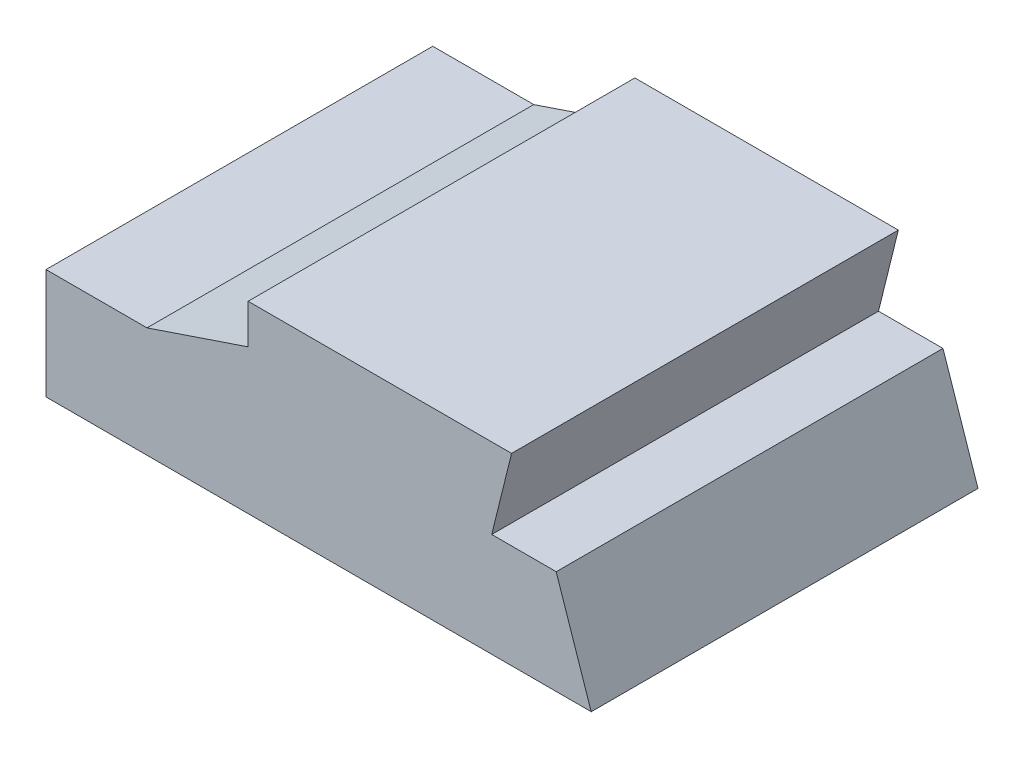
ISO-10303-21;
HEADER;
FILE_DESCRIPTION(('STEP AP214'),'2;1');
FILE_NAME('part.step','',(''),(''),'','','');
FILE_SCHEMA(('AUTOMOTIVE_DESIGN { 1 0 10303 214 1 1 1 1 }'));
ENDSEC;
DATA;
#1=APPLICATION_CONTEXT('core data for automotive mechanical design processes');
#2=APPLICATION_PROTOCOL_DEFINITION('international standard','automotive_design',2000,#1);
#3=PRODUCT_CONTEXT('',#1,'mechanical');
#4=PRODUCT('Part','Part','',(#3));
#5=PRODUCT_RELATED_PRODUCT_CATEGORY('part','',(#4));
#6=PRODUCT_DEFINITION_FORMATION('','',#4);
#7=PRODUCT_DEFINITION_CONTEXT('part definition',#1,'design');
#8=PRODUCT_DEFINITION('design','',#6,#7);
#9=PRODUCT_DEFINITION_SHAPE('','',#8);
#10=(LENGTH_UNIT() NAMED_UNIT(*) SI_UNIT(.MILLI.,.METRE.));
#11=(NAMED_UNIT(*) PLANE_ANGLE_UNIT() SI_UNIT($,.RADIAN.));
#12=(NAMED_UNIT(*) SI_UNIT($,.STERADIAN.) SOLID_ANGLE_UNIT());
#13=UNCERTAINTY_MEASURE_WITH_UNIT(LENGTH_MEASURE(1.E-05),#10,'distance_accuracy_value','');
#14=(GEOMETRIC_REPRESENTATION_CONTEXT(3) GLOBAL_UNCERTAINTY_ASSIGNED_CONTEXT((#13)) GLOBAL_UNIT_ASSIGNED_CONTEXT((#10,
#11,#12)) REPRESENTATION_CONTEXT('',''));
#15=CARTESIAN_POINT('',(0.,0.,0.));
#16=DIRECTION('',(0.,0.,1.));
#17=DIRECTION('',(1.,0.,0.));
#18=AXIS2_PLACEMENT_3D('',#15,#16,#17);
#19=CARTESIAN_POINT('',(120.381757685379,47.5616320433758,-50.01));
#20=DIRECTION('',(0.,1.,0.));
#21=DIRECTION('',(0.,0.,1.));
#22=AXIS2_PLACEMENT_3D('',#19,#20,#21);
#23=PLANE('',#22);
#24=DIRECTION('',(0.,0.,-1.));
#25=VECTOR('',#24,1.);
#26=CARTESIAN_POINT('',(120.381757685379,47.5616320433758,50.));
#27=LINE('',#26,#25);
#28=CARTESIAN_POINT('',(120.381757685379,47.5616320433758,50.));
#29=VERTEX_POINT('',#28);
#30=CARTESIAN_POINT('',(120.381757685379,47.5616320433758,-50.));
#31=VERTEX_POINT('',#30);
#32=EDGE_CURVE('E182',#29,#31,#27,.T.);
#33=ORIENTED_EDGE('',*,*,#32,.T.);
#34=DIRECTION('',(-1.,0.,0.));
#35=VECTOR('',#34,1.);
#36=CARTESIAN_POINT('',(0.,47.5616320433758,-50.));
#37=LINE('',#36,#35);
#38=CARTESIAN_POINT('',(52.259104563702,47.5616320433758,-50.));
#39=VERTEX_POINT('',#38);
#40=EDGE_CURVE('E178',#31,#39,#37,.T.);
#41=ORIENTED_EDGE('',*,*,#40,.T.);
#42=DIRECTION('',(0.,0.,1.));
#43=VECTOR('',#42,1.);
#44=CARTESIAN_POINT('',(52.259104563702,47.5616320433758,50.));
#45=LINE('',#44,#43);
#46=CARTESIAN_POINT('',(52.259104563702,47.5616320433758,50.));
#47=VERTEX_POINT('',#46);
#48=EDGE_CURVE('E174',#39,#47,#45,.T.);
#49=ORIENTED_EDGE('',*,*,#48,.T.);
#50=DIRECTION('',(-1.,0.,0.));
#51=VECTOR('',#50,1.);
#52=CARTESIAN_POINT('',(0.,47.5616320433758,50.));
#53=LINE('',#52,#51);
#54=EDGE_CURVE('E170',#29,#47,#53,.T.);
#55=ORIENTED_EDGE('',*,*,#54,.F.);
#56=EDGE_LOOP('',(#33,#41,#49,#55));
#57=FACE_BOUND('',#56,.T.);
#58=ADVANCED_FACE('F41',(#57),#23,.T.);
#59=CARTESIAN_POINT('',(52.259104563702,0.,50.));
#60=DIRECTION('',(1.,0.,0.));
#61=DIRECTION('',(0.,1.,0.));
#62=AXIS2_PLACEMENT_3D('',#59,#60,#61);
#63=PLANE('',#62);
#64=ORIENTED_EDGE('',*,*,#48,.F.);
#65=DIRECTION('',(0.,-1.,0.));
#66=VECTOR('',#65,1.);
#67=CARTESIAN_POINT('',(52.259104563702,0.,-50.));
#68=LINE('',#67,#66);
#69=CARTESIAN_POINT('',(52.259104563702,37.3479726333165,-50.));
#70=VERTEX_POINT('',#69);
#71=EDGE_CURVE('E11',#39,#70,#68,.T.);
#72=ORIENTED_EDGE('',*,*,#71,.T.);
#73=DIRECTION('',(0.,0.,-1.));
#74=VECTOR('',#73,1.);
#75=CARTESIAN_POINT('',(52.259104563702,37.3479726333165,50.));
#76=LINE('',#75,#74);
#77=CARTESIAN_POINT('',(52.259104563702,37.3479726333165,50.));
#78=VERTEX_POINT('',#77);
#79=EDGE_CURVE('E173',#78,#70,#76,.T.);
#80=ORIENTED_EDGE('',*,*,#79,.F.);
#81=DIRECTION('',(0.,-1.,0.));
#82=VECTOR('',#81,1.);
#83=CARTESIAN_POINT('',(52.259104563702,0.,50.));
#84=LINE('',#83,#82);
#85=EDGE_CURVE('E89',#47,#78,#84,.T.);
#86=ORIENTED_EDGE('',*,*,#85,.F.);
#87=EDGE_LOOP('',(#64,#72,#80,#86));
#88=FACE_BOUND('',#87,.T.);
#89=ADVANCED_FACE('F218',(#88),#63,.F.);
#90=CARTESIAN_POINT('',(0.,0.,50.));
#91=DIRECTION('',(0.,0.,1.));
#92=DIRECTION('',(1.,0.,0.));
#93=AXIS2_PLACEMENT_3D('',#90,#91,#92);
#94=PLANE('',#93);
#95=DIRECTION('',(0.240325147389719,0.970692445387369,0.));
#96=VECTOR('',#95,1.);
#97=CARTESIAN_POINT('',(102.333704272792,-25.3358957094596,50.));
#98=LINE('',#97,#96);
#99=CARTESIAN_POINT('',(115.249995774804,26.8340362331716,50.));
#100=VERTEX_POINT('',#99);
#101=EDGE_CURVE('E149',#100,#29,#98,.T.);
#102=ORIENTED_EDGE('',*,*,#101,.T.);
#103=ORIENTED_EDGE('',*,*,#54,.T.);
#104=ORIENTED_EDGE('',*,*,#85,.T.);
#105=DIRECTION('',(-0.947542650482181,-0.31962935646965,0.));
#106=VECTOR('',#105,1.);
#107=CARTESIAN_POINT('',(-5.97235539753042,17.7050741693524,50.));
#108=LINE('',#107,#106);
#109=CARTESIAN_POINT('',(26.1205986801413,28.5308140490679,50.));
#110=VERTEX_POINT('',#109);
#111=EDGE_CURVE('E84',#78,#110,#108,.T.);
#112=ORIENTED_EDGE('',*,*,#111,.T.);
#113=DIRECTION('',(-1.,0.,0.));
#114=VECTOR('',#113,1.);
#115=CARTESIAN_POINT('',(0.,28.5308140490679,50.));
#116=LINE('',#115,#114);
#117=CARTESIAN_POINT('',(0.,28.5308140490679,50.));
#118=VERTEX_POINT('',#117);
#119=EDGE_CURVE('E165',#110,#118,#116,.T.);
#120=ORIENTED_EDGE('',*,*,#119,.T.);
#121=DIRECTION('',(0.,-1.,0.));
#122=VECTOR('',#121,1.);
#123=CARTESIAN_POINT('',(0.,0.,50.));
#124=LINE('',#123,#122);
#125=CARTESIAN_POINT('',(0.,0.,50.));
#126=VERTEX_POINT('',#125);
#127=EDGE_CURVE('E131',#118,#126,#124,.T.);
#128=ORIENTED_EDGE('',*,*,#127,.T.);
#129=DIRECTION('',(1.,0.,0.));
#130=VECTOR('',#129,1.);
#131=CARTESIAN_POINT('',(0.,0.,50.));
#132=LINE('',#131,#130);
#133=CARTESIAN_POINT('',(140.98,0.,50.));
#134=VERTEX_POINT('',#133);
#135=EDGE_CURVE('E160',#126,#134,#132,.T.);
#136=ORIENTED_EDGE('',*,*,#135,.T.);
#137=DIRECTION('',(-0.31962935646965,0.947542650482182,0.));
#138=VECTOR('',#137,1.);
#139=CARTESIAN_POINT('',(126.577070760585,42.6975478628124,50.));
#140=LINE('',#139,#138);
#141=CARTESIAN_POINT('',(131.928221984174,26.8340362331716,50.));
#142=VERTEX_POINT('',#141);
#143=EDGE_CURVE('E157',#134,#142,#140,.T.);
#144=ORIENTED_EDGE('',*,*,#143,.T.);
#145=DIRECTION('',(-1.,0.,0.));
#146=VECTOR('',#145,1.);
#147=CARTESIAN_POINT('',(0.,26.8340362331716,50.));
#148=LINE('',#147,#146);
#149=EDGE_CURVE('E153',#142,#100,#148,.T.);
#150=ORIENTED_EDGE('',*,*,#149,.T.);
#151=EDGE_LOOP('',(#102,#103,#104,#112,#120,#128,#136,#144,#150));
#152=FACE_BOUND('',#151,.T.);
#153=ADVANCED_FACE('F43',(#152),#94,.T.);
#154=CARTESIAN_POINT('',(0.,0.,-50.));
#155=DIRECTION('',(0.,0.,1.));
#156=DIRECTION('',(1.,0.,0.));
#157=AXIS2_PLACEMENT_3D('',#154,#155,#156);
#158=PLANE('',#157);
#159=ORIENTED_EDGE('',*,*,#40,.F.);
#160=DIRECTION('',(0.240325147389719,0.970692445387369,0.));
#161=VECTOR('',#160,1.);
#162=CARTESIAN_POINT('',(102.333704272792,-25.3358957094596,-50.));
#163=LINE('',#162,#161);
#164=CARTESIAN_POINT('',(115.249995774804,26.8340362331716,-50.));
#165=VERTEX_POINT('',#164);
#166=EDGE_CURVE('E186',#165,#31,#163,.T.);
#167=ORIENTED_EDGE('',*,*,#166,.F.);
#168=DIRECTION('',(-1.,0.,0.));
#169=VECTOR('',#168,1.);
#170=CARTESIAN_POINT('',(0.,26.8340362331716,-50.));
#171=LINE('',#170,#169);
#172=CARTESIAN_POINT('',(131.928221984174,26.8340362331716,-50.));
#173=VERTEX_POINT('',#172);
#174=EDGE_CURVE('E97',#173,#165,#171,.T.);
#175=ORIENTED_EDGE('',*,*,#174,.F.);
#176=DIRECTION('',(-0.31962935646965,0.947542650482182,0.));
#177=VECTOR('',#176,1.);
#178=CARTESIAN_POINT('',(126.577070760585,42.6975478628124,-50.));
#179=LINE('',#178,#177);
#180=CARTESIAN_POINT('',(140.98,0.,-50.));
#181=VERTEX_POINT('',#180);
#182=EDGE_CURVE('E143',#181,#173,#179,.T.);
#183=ORIENTED_EDGE('',*,*,#182,.F.);
#184=DIRECTION('',(1.,0.,0.));
#185=VECTOR('',#184,1.);
#186=CARTESIAN_POINT('',(0.,0.,-50.));
#187=LINE('',#186,#185);
#188=CARTESIAN_POINT('',(0.,0.,-50.));
#189=VERTEX_POINT('',#188);
#190=EDGE_CURVE('E139',#189,#181,#187,.T.);
#191=ORIENTED_EDGE('',*,*,#190,.F.);
#192=DIRECTION('',(0.,-1.,0.));
#193=VECTOR('',#192,1.);
#194=CARTESIAN_POINT('',(0.,0.,-50.));
#195=LINE('',#194,#193);
#196=CARTESIAN_POINT('',(0.,28.5308140490679,-50.));
#197=VERTEX_POINT('',#196);
#198=EDGE_CURVE('E125',#197,#189,#195,.T.);
#199=ORIENTED_EDGE('',*,*,#198,.F.);
#200=DIRECTION('',(-1.,0.,0.));
#201=VECTOR('',#200,1.);
#202=CARTESIAN_POINT('',(0.,28.5308140490679,-50.));
#203=LINE('',#202,#201);
#204=CARTESIAN_POINT('',(26.1205986801413,28.5308140490679,-50.));
#205=VERTEX_POINT('',#204);
#206=EDGE_CURVE('E114',#205,#197,#203,.T.);
#207=ORIENTED_EDGE('',*,*,#206,.F.);
#208=DIRECTION('',(-0.947542650482181,-0.31962935646965,0.));
#209=VECTOR('',#208,1.);
#210=CARTESIAN_POINT('',(-5.97235539753042,17.7050741693524,-50.));
#211=LINE('',#210,#209);
#212=EDGE_CURVE('E51',#70,#205,#211,.T.);
#213=ORIENTED_EDGE('',*,*,#212,.F.);
#214=ORIENTED_EDGE('',*,*,#71,.F.);
#215=EDGE_LOOP('',(#159,#167,#175,#183,#191,#199,#207,#213,#214));
#216=FACE_BOUND('',#215,.T.);
#217=ADVANCED_FACE('F137',(#216),#158,.F.);
#218=CARTESIAN_POINT('',(-5.97235539753042,17.7050741693524,50.));
#219=DIRECTION('',(0.31962935646965,-0.947542650482181,0.));
#220=DIRECTION('',(0.947542650482181,0.31962935646965,0.));
#221=AXIS2_PLACEMENT_3D('',#218,#219,#220);
#222=PLANE('',#221);
#223=ORIENTED_EDGE('',*,*,#212,.T.);
#224=DIRECTION('',(0.,0.,-1.));
#225=VECTOR('',#224,1.);
#226=CARTESIAN_POINT('',(26.1205986801413,28.5308140490679,50.));
#227=LINE('',#226,#225);
#228=EDGE_CURVE('E120',#110,#205,#227,.T.);
#229=ORIENTED_EDGE('',*,*,#228,.F.);
#230=ORIENTED_EDGE('',*,*,#111,.F.);
#231=ORIENTED_EDGE('',*,*,#79,.T.);
#232=EDGE_LOOP('',(#223,#229,#230,#231));
#233=FACE_BOUND('',#232,.T.);
#234=ADVANCED_FACE('F222',(#233),#222,.F.);
#235=CARTESIAN_POINT('',(0.,28.5308140490679,50.));
#236=DIRECTION('',(0.,-1.,0.));
#237=DIRECTION('',(0.,0.,-1.));
#238=AXIS2_PLACEMENT_3D('',#235,#236,#237);
#239=PLANE('',#238);
#240=ORIENTED_EDGE('',*,*,#206,.T.);
#241=DIRECTION('',(0.,0.,-1.));
#242=VECTOR('',#241,1.);
#243=CARTESIAN_POINT('',(0.,28.5308140490679,50.));
#244=LINE('',#243,#242);
#245=EDGE_CURVE('E118',#118,#197,#244,.T.);
#246=ORIENTED_EDGE('',*,*,#245,.F.);
#247=ORIENTED_EDGE('',*,*,#119,.F.);
#248=ORIENTED_EDGE('',*,*,#228,.T.);
#249=EDGE_LOOP('',(#240,#246,#247,#248));
#250=FACE_BOUND('',#249,.T.);
#251=ADVANCED_FACE('F116',(#250),#239,.F.);
#252=CARTESIAN_POINT('',(0.,0.,50.));
#253=DIRECTION('',(1.,0.,0.));
#254=DIRECTION('',(0.,0.,-1.));
#255=AXIS2_PLACEMENT_3D('',#252,#253,#254);
#256=PLANE('',#255);
#257=ORIENTED_EDGE('',*,*,#198,.T.);
#258=DIRECTION('',(0.,0.,-1.));
#259=VECTOR('',#258,1.);
#260=CARTESIAN_POINT('',(0.,0.,50.));
#261=LINE('',#260,#259);
#262=EDGE_CURVE('E133',#126,#189,#261,.T.);
#263=ORIENTED_EDGE('',*,*,#262,.F.);
#264=ORIENTED_EDGE('',*,*,#127,.F.);
#265=ORIENTED_EDGE('',*,*,#245,.T.);
#266=EDGE_LOOP('',(#257,#263,#264,#265));
#267=FACE_BOUND('',#266,.T.);
#268=ADVANCED_FACE('F128',(#267),#256,.F.);
#269=CARTESIAN_POINT('',(0.,0.,50.));
#270=DIRECTION('',(0.,1.,0.));
#271=DIRECTION('',(0.,0.,1.));
#272=AXIS2_PLACEMENT_3D('',#269,#270,#271);
#273=PLANE('',#272);
#274=ORIENTED_EDGE('',*,*,#190,.T.);
#275=DIRECTION('',(0.,0.,-1.));
#276=VECTOR('',#275,1.);
#277=CARTESIAN_POINT('',(140.98,0.,50.));
#278=LINE('',#277,#276);
#279=EDGE_CURVE('E207',#134,#181,#278,.T.);
#280=ORIENTED_EDGE('',*,*,#279,.F.);
#281=ORIENTED_EDGE('',*,*,#135,.F.);
#282=ORIENTED_EDGE('',*,*,#262,.T.);
#283=EDGE_LOOP('',(#274,#280,#281,#282));
#284=FACE_BOUND('',#283,.T.);
#285=ADVANCED_FACE('F229',(#284),#273,.F.);
#286=CARTESIAN_POINT('',(126.577070760585,42.6975478628124,50.));
#287=DIRECTION('',(-0.947542650482181,-0.31962935646965,0.));
#288=DIRECTION('',(0.31962935646965,-0.947542650482182,0.));
#289=AXIS2_PLACEMENT_3D('',#286,#287,#288);
#290=PLANE('',#289);
#291=ORIENTED_EDGE('',*,*,#182,.T.);
#292=DIRECTION('',(0.,0.,-1.));
#293=VECTOR('',#292,1.);
#294=CARTESIAN_POINT('',(131.928221984174,26.8340362331716,50.));
#295=LINE('',#294,#293);
#296=EDGE_CURVE('E204',#142,#173,#295,.T.);
#297=ORIENTED_EDGE('',*,*,#296,.F.);
#298=ORIENTED_EDGE('',*,*,#143,.F.);
#299=ORIENTED_EDGE('',*,*,#279,.T.);
#300=EDGE_LOOP('',(#291,#297,#298,#299));
#301=FACE_BOUND('',#300,.T.);
#302=ADVANCED_FACE('F202',(#301),#290,.F.);
#303=CARTESIAN_POINT('',(0.,26.8340362331716,50.));
#304=DIRECTION('',(0.,-1.,0.));
#305=DIRECTION('',(1.,0.,0.));
#306=AXIS2_PLACEMENT_3D('',#303,#304,#305);
#307=PLANE('',#306);
#308=ORIENTED_EDGE('',*,*,#174,.T.);
#309=DIRECTION('',(0.,0.,-1.));
#310=VECTOR('',#309,1.);
#311=CARTESIAN_POINT('',(115.249995774804,26.8340362331716,50.));
#312=LINE('',#311,#310);
#313=EDGE_CURVE('E154',#100,#165,#312,.T.);
#314=ORIENTED_EDGE('',*,*,#313,.F.);
#315=ORIENTED_EDGE('',*,*,#149,.F.);
#316=ORIENTED_EDGE('',*,*,#296,.T.);
#317=EDGE_LOOP('',(#308,#314,#315,#316));
#318=FACE_BOUND('',#317,.T.);
#319=ADVANCED_FACE('F208',(#318),#307,.F.);
#320=CARTESIAN_POINT('',(102.333704272792,-25.3358957094596,50.));
#321=DIRECTION('',(-0.970692445387369,0.240325147389719,0.));
#322=DIRECTION('',(-0.240325147389719,-0.970692445387369,0.));
#323=AXIS2_PLACEMENT_3D('',#320,#321,#322);
#324=PLANE('',#323);
#325=ORIENTED_EDGE('',*,*,#166,.T.);
#326=ORIENTED_EDGE('',*,*,#32,.F.);
#327=ORIENTED_EDGE('',*,*,#101,.F.);
#328=ORIENTED_EDGE('',*,*,#313,.T.);
#329=EDGE_LOOP('',(#325,#326,#327,#328));
#330=FACE_BOUND('',#329,.T.);
#331=ADVANCED_FACE('F216',(#330),#324,.F.);
#332=CLOSED_SHELL('',(#58,#89,#153,#217,#234,#251,#268,#285,#302,#319,#331));
#333=MANIFOLD_SOLID_BREP('B2',#332);
#334=ADVANCED_BREP_SHAPE_REPRESENTATION('',(#18,#333),#14);
#335=SHAPE_DEFINITION_REPRESENTATION(#9,#334);
ENDSEC;
END-ISO-10303-21;
